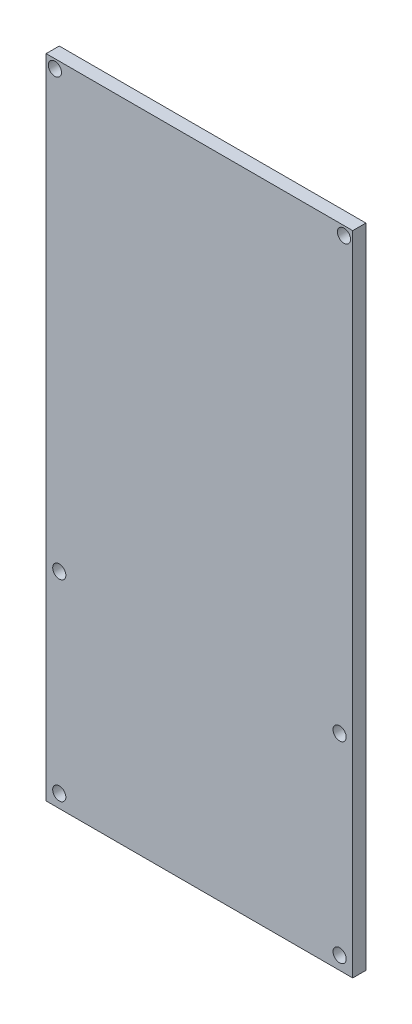
ISO-10303-21;
HEADER;
FILE_DESCRIPTION(('STEP AP214'),'2;1');
FILE_NAME('part.step','',(''),(''),'','','');
FILE_SCHEMA(('AUTOMOTIVE_DESIGN { 1 0 10303 214 1 1 1 1 }'));
ENDSEC;
DATA;
#1=APPLICATION_CONTEXT('core data for automotive mechanical design processes');
#2=APPLICATION_PROTOCOL_DEFINITION('international standard','automotive_design',2000,#1);
#3=PRODUCT_CONTEXT('',#1,'mechanical');
#4=PRODUCT('Part','Part','',(#3));
#5=PRODUCT_RELATED_PRODUCT_CATEGORY('part','',(#4));
#6=PRODUCT_DEFINITION_FORMATION('','',#4);
#7=PRODUCT_DEFINITION_CONTEXT('part definition',#1,'design');
#8=PRODUCT_DEFINITION('design','',#6,#7);
#9=PRODUCT_DEFINITION_SHAPE('','',#8);
#10=(LENGTH_UNIT() NAMED_UNIT(*) SI_UNIT(.MILLI.,.METRE.));
#11=(NAMED_UNIT(*) PLANE_ANGLE_UNIT() SI_UNIT($,.RADIAN.));
#12=(NAMED_UNIT(*) SI_UNIT($,.STERADIAN.) SOLID_ANGLE_UNIT());
#13=UNCERTAINTY_MEASURE_WITH_UNIT(LENGTH_MEASURE(1.E-05),#10,'distance_accuracy_value','');
#14=(GEOMETRIC_REPRESENTATION_CONTEXT(3) GLOBAL_UNCERTAINTY_ASSIGNED_CONTEXT((#13)) GLOBAL_UNIT_ASSIGNED_CONTEXT((#10,
#11,#12)) REPRESENTATION_CONTEXT('',''));
#15=CARTESIAN_POINT('',(0.,0.,0.));
#16=DIRECTION('',(0.,0.,1.));
#17=DIRECTION('',(1.,0.,0.));
#18=AXIS2_PLACEMENT_3D('',#15,#16,#17);
#19=CARTESIAN_POINT('',(32.,-50.8980474492835,12.7));
#20=DIRECTION('',(0.,0.,-1.));
#21=DIRECTION('',(-1.,0.,0.));
#22=AXIS2_PLACEMENT_3D('',#19,#20,#21);
#23=CYLINDRICAL_SURFACE('',#22,1.5);
#24=CARTESIAN_POINT('',(32.,-50.8980474492835,-3.));
#25=DIRECTION('',(0.,0.,-1.));
#26=DIRECTION('',(-1.,0.,0.));
#27=AXIS2_PLACEMENT_3D('',#24,#25,#26);
#28=CIRCLE('',#27,1.5);
#29=CARTESIAN_POINT('',(30.5,-50.8980474492835,-3.));
#30=VERTEX_POINT('',#29);
#31=EDGE_CURVE('E144',#30,#30,#28,.T.);
#32=ORIENTED_EDGE('',*,*,#31,.T.);
#33=EDGE_LOOP('',(#32));
#34=FACE_BOUND('',#33,.T.);
#35=CARTESIAN_POINT('',(32.,-50.8980474492835,0.));
#36=DIRECTION('',(0.,0.,1.));
#37=DIRECTION('',(1.,0.,0.));
#38=AXIS2_PLACEMENT_3D('',#35,#36,#37);
#39=CIRCLE('',#38,1.5);
#40=CARTESIAN_POINT('',(33.5,-50.8980474492835,0.));
#41=VERTEX_POINT('',#40);
#42=EDGE_CURVE('E161',#41,#41,#39,.F.);
#43=ORIENTED_EDGE('',*,*,#42,.F.);
#44=EDGE_LOOP('',(#43));
#45=FACE_BOUND('',#44,.T.);
#46=ADVANCED_FACE('F42',(#34,#45),#23,.F.);
#47=CARTESIAN_POINT('',(-32.,-94.7685274477065,12.7));
#48=DIRECTION('',(0.,0.,-1.));
#49=DIRECTION('',(-1.,0.,0.));
#50=AXIS2_PLACEMENT_3D('',#47,#48,#49);
#51=CYLINDRICAL_SURFACE('',#50,1.5);
#52=CARTESIAN_POINT('',(-32.,-94.7685274477065,-3.));
#53=DIRECTION('',(0.,0.,-1.));
#54=DIRECTION('',(-1.,0.,0.));
#55=AXIS2_PLACEMENT_3D('',#52,#53,#54);
#56=CIRCLE('',#55,1.5);
#57=CARTESIAN_POINT('',(-33.5,-94.7685274477065,-3.));
#58=VERTEX_POINT('',#57);
#59=EDGE_CURVE('E139',#58,#58,#56,.T.);
#60=ORIENTED_EDGE('',*,*,#59,.T.);
#61=EDGE_LOOP('',(#60));
#62=FACE_BOUND('',#61,.T.);
#63=CARTESIAN_POINT('',(-32.,-94.7685274477065,0.));
#64=DIRECTION('',(0.,0.,1.));
#65=DIRECTION('',(1.,0.,0.));
#66=AXIS2_PLACEMENT_3D('',#63,#64,#65);
#67=CIRCLE('',#66,1.5);
#68=CARTESIAN_POINT('',(-30.5,-94.7685274477065,0.));
#69=VERTEX_POINT('',#68);
#70=EDGE_CURVE('E153',#69,#69,#67,.F.);
#71=ORIENTED_EDGE('',*,*,#70,.F.);
#72=EDGE_LOOP('',(#71));
#73=FACE_BOUND('',#72,.T.);
#74=ADVANCED_FACE('F191',(#62,#73),#51,.F.);
#75=CARTESIAN_POINT('',(35.,-97.7685274477065,9.99999999999972));
#76=DIRECTION('',(0.,-1.,0.));
#77=DIRECTION('',(1.,0.,0.));
#78=AXIS2_PLACEMENT_3D('',#75,#76,#77);
#79=PLANE('',#78);
#80=DIRECTION('',(1.,0.,0.));
#81=VECTOR('',#80,1.);
#82=CARTESIAN_POINT('',(-35.,-97.7685274477065,0.));
#83=LINE('',#82,#81);
#84=CARTESIAN_POINT('',(-35.,-97.7685274477065,0.));
#85=VERTEX_POINT('',#84);
#86=CARTESIAN_POINT('',(35.,-97.7685274477065,0.));
#87=VERTEX_POINT('',#86);
#88=EDGE_CURVE('E85',#85,#87,#83,.T.);
#89=ORIENTED_EDGE('',*,*,#88,.F.);
#90=DIRECTION('',(0.,0.,1.));
#91=VECTOR('',#90,1.);
#92=CARTESIAN_POINT('',(-35.,-97.7685274477065,9.99999999999972));
#93=LINE('',#92,#91);
#94=CARTESIAN_POINT('',(-35.,-97.7685274477065,-3.));
#95=VERTEX_POINT('',#94);
#96=EDGE_CURVE('E106',#95,#85,#93,.T.);
#97=ORIENTED_EDGE('',*,*,#96,.F.);
#98=DIRECTION('',(-1.,0.,0.));
#99=VECTOR('',#98,1.);
#100=CARTESIAN_POINT('',(35.,-97.7685274477065,-3.));
#101=LINE('',#100,#99);
#102=CARTESIAN_POINT('',(35.,-97.7685274477065,-3.));
#103=VERTEX_POINT('',#102);
#104=EDGE_CURVE('E103',#103,#95,#101,.T.);
#105=ORIENTED_EDGE('',*,*,#104,.F.);
#106=DIRECTION('',(0.,0.,1.));
#107=VECTOR('',#106,1.);
#108=CARTESIAN_POINT('',(35.,-97.7685274477065,9.99999999999972));
#109=LINE('',#108,#107);
#110=EDGE_CURVE('E96',#103,#87,#109,.T.);
#111=ORIENTED_EDGE('',*,*,#110,.T.);
#112=EDGE_LOOP('',(#89,#97,#105,#111));
#113=FACE_BOUND('',#112,.T.);
#114=ADVANCED_FACE('F101',(#113),#79,.T.);
#115=CARTESIAN_POINT('',(35.,-50.,50.));
#116=DIRECTION('',(-1.,0.,0.));
#117=DIRECTION('',(0.,0.,1.));
#118=AXIS2_PLACEMENT_3D('',#115,#116,#117);
#119=PLANE('',#118);
#120=DIRECTION('',(0.,1.,0.));
#121=VECTOR('',#120,1.);
#122=CARTESIAN_POINT('',(35.,50.,0.));
#123=LINE('',#122,#121);
#124=CARTESIAN_POINT('',(35.,50.,0.));
#125=VERTEX_POINT('',#124);
#126=EDGE_CURVE('E87',#87,#125,#123,.T.);
#127=ORIENTED_EDGE('',*,*,#126,.F.);
#128=ORIENTED_EDGE('',*,*,#110,.F.);
#129=DIRECTION('',(0.,-1.,0.));
#130=VECTOR('',#129,1.);
#131=CARTESIAN_POINT('',(35.,50.,-3.));
#132=LINE('',#131,#130);
#133=CARTESIAN_POINT('',(35.,50.,-3.));
#134=VERTEX_POINT('',#133);
#135=EDGE_CURVE('E124',#134,#103,#132,.T.);
#136=ORIENTED_EDGE('',*,*,#135,.F.);
#137=DIRECTION('',(0.,0.,-1.));
#138=VECTOR('',#137,1.);
#139=CARTESIAN_POINT('',(35.,50.,50.));
#140=LINE('',#139,#138);
#141=EDGE_CURVE('E11',#125,#134,#140,.T.);
#142=ORIENTED_EDGE('',*,*,#141,.F.);
#143=EDGE_LOOP('',(#127,#128,#136,#142));
#144=FACE_BOUND('',#143,.T.);
#145=ADVANCED_FACE('F94',(#144),#119,.F.);
#146=CARTESIAN_POINT('',(35.,50.,50.));
#147=DIRECTION('',(0.,-1.,0.));
#148=DIRECTION('',(0.,0.,-1.));
#149=AXIS2_PLACEMENT_3D('',#146,#147,#148);
#150=PLANE('',#149);
#151=DIRECTION('',(-1.,0.,0.));
#152=VECTOR('',#151,1.);
#153=CARTESIAN_POINT('',(-35.,50.,0.));
#154=LINE('',#153,#152);
#155=CARTESIAN_POINT('',(-35.,50.,0.));
#156=VERTEX_POINT('',#155);
#157=EDGE_CURVE('E97',#125,#156,#154,.T.);
#158=ORIENTED_EDGE('',*,*,#157,.F.);
#159=ORIENTED_EDGE('',*,*,#141,.T.);
#160=DIRECTION('',(1.,0.,0.));
#161=VECTOR('',#160,1.);
#162=CARTESIAN_POINT('',(35.,50.,-3.));
#163=LINE('',#162,#161);
#164=CARTESIAN_POINT('',(-35.,50.,-3.));
#165=VERTEX_POINT('',#164);
#166=EDGE_CURVE('E112',#165,#134,#163,.T.);
#167=ORIENTED_EDGE('',*,*,#166,.F.);
#168=DIRECTION('',(0.,0.,-1.));
#169=VECTOR('',#168,1.);
#170=CARTESIAN_POINT('',(-35.,50.,50.));
#171=LINE('',#170,#169);
#172=EDGE_CURVE('E53',#156,#165,#171,.T.);
#173=ORIENTED_EDGE('',*,*,#172,.F.);
#174=EDGE_LOOP('',(#158,#159,#167,#173));
#175=FACE_BOUND('',#174,.T.);
#176=ADVANCED_FACE('F213',(#175),#150,.F.);
#177=CARTESIAN_POINT('',(-35.,-50.,50.));
#178=DIRECTION('',(1.,0.,0.));
#179=DIRECTION('',(0.,1.,0.));
#180=AXIS2_PLACEMENT_3D('',#177,#178,#179);
#181=PLANE('',#180);
#182=DIRECTION('',(0.,-1.,0.));
#183=VECTOR('',#182,1.);
#184=CARTESIAN_POINT('',(-35.,50.,0.));
#185=LINE('',#184,#183);
#186=EDGE_CURVE('E63',#156,#85,#185,.T.);
#187=ORIENTED_EDGE('',*,*,#186,.F.);
#188=ORIENTED_EDGE('',*,*,#172,.T.);
#189=DIRECTION('',(0.,1.,0.));
#190=VECTOR('',#189,1.);
#191=CARTESIAN_POINT('',(-35.,50.,-3.));
#192=LINE('',#191,#190);
#193=EDGE_CURVE('E118',#95,#165,#192,.T.);
#194=ORIENTED_EDGE('',*,*,#193,.F.);
#195=ORIENTED_EDGE('',*,*,#96,.T.);
#196=EDGE_LOOP('',(#187,#188,#194,#195));
#197=FACE_BOUND('',#196,.T.);
#198=ADVANCED_FACE('F46',(#197),#181,.F.);
#199=CARTESIAN_POINT('',(33.,48.,12.7));
#200=DIRECTION('',(0.,0.,-1.));
#201=DIRECTION('',(-1.,0.,0.));
#202=AXIS2_PLACEMENT_3D('',#199,#200,#201);
#203=CYLINDRICAL_SURFACE('',#202,1.5);
#204=CARTESIAN_POINT('',(33.,48.,-3.));
#205=DIRECTION('',(0.,0.,-1.));
#206=DIRECTION('',(-1.,0.,0.));
#207=AXIS2_PLACEMENT_3D('',#204,#205,#206);
#208=CIRCLE('',#207,1.5);
#209=CARTESIAN_POINT('',(31.5,48.,-3.));
#210=VERTEX_POINT('',#209);
#211=EDGE_CURVE('E121',#210,#210,#208,.T.);
#212=ORIENTED_EDGE('',*,*,#211,.T.);
#213=EDGE_LOOP('',(#212));
#214=FACE_BOUND('',#213,.T.);
#215=CARTESIAN_POINT('',(33.,48.,0.));
#216=DIRECTION('',(0.,0.,1.));
#217=DIRECTION('',(1.,0.,0.));
#218=AXIS2_PLACEMENT_3D('',#215,#216,#217);
#219=CIRCLE('',#218,1.5);
#220=CARTESIAN_POINT('',(34.5,48.,0.));
#221=VERTEX_POINT('',#220);
#222=EDGE_CURVE('E149',#221,#221,#219,.F.);
#223=ORIENTED_EDGE('',*,*,#222,.F.);
#224=EDGE_LOOP('',(#223));
#225=FACE_BOUND('',#224,.T.);
#226=ADVANCED_FACE('F210',(#214,#225),#203,.F.);
#227=CARTESIAN_POINT('',(-32.,-50.8980474492835,12.7));
#228=DIRECTION('',(0.,0.,-1.));
#229=DIRECTION('',(-1.,0.,0.));
#230=AXIS2_PLACEMENT_3D('',#227,#228,#229);
#231=CYLINDRICAL_SURFACE('',#230,1.5);
#232=CARTESIAN_POINT('',(-32.,-50.8980474492835,-3.));
#233=DIRECTION('',(0.,0.,-1.));
#234=DIRECTION('',(-1.,0.,0.));
#235=AXIS2_PLACEMENT_3D('',#232,#233,#234);
#236=CIRCLE('',#235,1.5);
#237=CARTESIAN_POINT('',(-33.5,-50.8980474492835,-3.));
#238=VERTEX_POINT('',#237);
#239=EDGE_CURVE('E131',#238,#238,#236,.T.);
#240=ORIENTED_EDGE('',*,*,#239,.T.);
#241=EDGE_LOOP('',(#240));
#242=FACE_BOUND('',#241,.T.);
#243=CARTESIAN_POINT('',(-32.,-50.8980474492835,0.));
#244=DIRECTION('',(0.,0.,1.));
#245=DIRECTION('',(1.,0.,0.));
#246=AXIS2_PLACEMENT_3D('',#243,#244,#245);
#247=CIRCLE('',#246,1.5);
#248=CARTESIAN_POINT('',(-30.5,-50.8980474492835,0.));
#249=VERTEX_POINT('',#248);
#250=EDGE_CURVE('E164',#249,#249,#247,.F.);
#251=ORIENTED_EDGE('',*,*,#250,.F.);
#252=EDGE_LOOP('',(#251));
#253=FACE_BOUND('',#252,.T.);
#254=ADVANCED_FACE('F204',(#242,#253),#231,.F.);
#255=CARTESIAN_POINT('',(32.,-94.7685274477065,12.7));
#256=DIRECTION('',(0.,0.,-1.));
#257=DIRECTION('',(-1.,0.,0.));
#258=AXIS2_PLACEMENT_3D('',#255,#256,#257);
#259=CYLINDRICAL_SURFACE('',#258,1.5);
#260=CARTESIAN_POINT('',(32.,-94.7685274477065,-3.));
#261=DIRECTION('',(0.,0.,-1.));
#262=DIRECTION('',(-1.,0.,0.));
#263=AXIS2_PLACEMENT_3D('',#260,#261,#262);
#264=CIRCLE('',#263,1.5);
#265=CARTESIAN_POINT('',(30.5,-94.7685274477065,-3.));
#266=VERTEX_POINT('',#265);
#267=EDGE_CURVE('E143',#266,#266,#264,.T.);
#268=ORIENTED_EDGE('',*,*,#267,.T.);
#269=EDGE_LOOP('',(#268));
#270=FACE_BOUND('',#269,.T.);
#271=CARTESIAN_POINT('',(32.,-94.7685274477065,0.));
#272=DIRECTION('',(0.,0.,1.));
#273=DIRECTION('',(1.,0.,0.));
#274=AXIS2_PLACEMENT_3D('',#271,#272,#273);
#275=CIRCLE('',#274,1.5);
#276=CARTESIAN_POINT('',(33.5,-94.7685274477065,0.));
#277=VERTEX_POINT('',#276);
#278=EDGE_CURVE('E160',#277,#277,#275,.F.);
#279=ORIENTED_EDGE('',*,*,#278,.F.);
#280=EDGE_LOOP('',(#279));
#281=FACE_BOUND('',#280,.T.);
#282=ADVANCED_FACE('F189',(#270,#281),#259,.F.);
#283=CARTESIAN_POINT('',(0.,0.,-3.));
#284=DIRECTION('',(0.,0.,-1.));
#285=DIRECTION('',(-1.,0.,0.));
#286=AXIS2_PLACEMENT_3D('',#283,#284,#285);
#287=PLANE('',#286);
#288=ORIENTED_EDGE('',*,*,#267,.F.);
#289=EDGE_LOOP('',(#288));
#290=FACE_BOUND('',#289,.T.);
#291=ORIENTED_EDGE('',*,*,#239,.F.);
#292=EDGE_LOOP('',(#291));
#293=FACE_BOUND('',#292,.T.);
#294=ORIENTED_EDGE('',*,*,#211,.F.);
#295=EDGE_LOOP('',(#294));
#296=FACE_BOUND('',#295,.T.);
#297=ORIENTED_EDGE('',*,*,#135,.T.);
#298=ORIENTED_EDGE('',*,*,#104,.T.);
#299=ORIENTED_EDGE('',*,*,#193,.T.);
#300=ORIENTED_EDGE('',*,*,#166,.T.);
#301=EDGE_LOOP('',(#297,#298,#299,#300));
#302=FACE_BOUND('',#301,.T.);
#303=CARTESIAN_POINT('',(-33.,48.,-3.));
#304=DIRECTION('',(0.,0.,-1.));
#305=DIRECTION('',(-1.,0.,0.));
#306=AXIS2_PLACEMENT_3D('',#303,#304,#305);
#307=CIRCLE('',#306,1.5);
#308=CARTESIAN_POINT('',(-34.5,48.,-3.));
#309=VERTEX_POINT('',#308);
#310=EDGE_CURVE('E129',#309,#309,#307,.T.);
#311=ORIENTED_EDGE('',*,*,#310,.F.);
#312=EDGE_LOOP('',(#311));
#313=FACE_BOUND('',#312,.T.);
#314=ORIENTED_EDGE('',*,*,#59,.F.);
#315=EDGE_LOOP('',(#314));
#316=FACE_BOUND('',#315,.T.);
#317=ORIENTED_EDGE('',*,*,#31,.F.);
#318=EDGE_LOOP('',(#317));
#319=FACE_BOUND('',#318,.T.);
#320=ADVANCED_FACE('F180',(#290,#293,#296,#302,#313,#316,#319),#287,.T.);
#321=CARTESIAN_POINT('',(-33.,48.,12.7));
#322=DIRECTION('',(0.,0.,-1.));
#323=DIRECTION('',(-1.,0.,0.));
#324=AXIS2_PLACEMENT_3D('',#321,#322,#323);
#325=CYLINDRICAL_SURFACE('',#324,1.5);
#326=ORIENTED_EDGE('',*,*,#310,.T.);
#327=EDGE_LOOP('',(#326));
#328=FACE_BOUND('',#327,.T.);
#329=CARTESIAN_POINT('',(-33.,48.,0.));
#330=DIRECTION('',(0.,0.,1.));
#331=DIRECTION('',(1.,0.,0.));
#332=AXIS2_PLACEMENT_3D('',#329,#330,#331);
#333=CIRCLE('',#332,1.5);
#334=CARTESIAN_POINT('',(-31.5,48.,0.));
#335=VERTEX_POINT('',#334);
#336=EDGE_CURVE('E48',#335,#335,#333,.F.);
#337=ORIENTED_EDGE('',*,*,#336,.F.);
#338=EDGE_LOOP('',(#337));
#339=FACE_BOUND('',#338,.T.);
#340=ADVANCED_FACE('F179',(#328,#339),#325,.F.);
#341=CARTESIAN_POINT('',(0.,0.,0.));
#342=DIRECTION('',(0.,0.,-1.));
#343=DIRECTION('',(-1.,0.,0.));
#344=AXIS2_PLACEMENT_3D('',#341,#342,#343);
#345=PLANE('',#344);
#346=ORIENTED_EDGE('',*,*,#222,.T.);
#347=EDGE_LOOP('',(#346));
#348=FACE_BOUND('',#347,.T.);
#349=ORIENTED_EDGE('',*,*,#70,.T.);
#350=EDGE_LOOP('',(#349));
#351=FACE_BOUND('',#350,.T.);
#352=ORIENTED_EDGE('',*,*,#278,.T.);
#353=EDGE_LOOP('',(#352));
#354=FACE_BOUND('',#353,.T.);
#355=ORIENTED_EDGE('',*,*,#42,.T.);
#356=EDGE_LOOP('',(#355));
#357=FACE_BOUND('',#356,.T.);
#358=ORIENTED_EDGE('',*,*,#250,.T.);
#359=EDGE_LOOP('',(#358));
#360=FACE_BOUND('',#359,.T.);
#361=ORIENTED_EDGE('',*,*,#336,.T.);
#362=EDGE_LOOP('',(#361));
#363=FACE_BOUND('',#362,.T.);
#364=ORIENTED_EDGE('',*,*,#186,.T.);
#365=ORIENTED_EDGE('',*,*,#88,.T.);
#366=ORIENTED_EDGE('',*,*,#126,.T.);
#367=ORIENTED_EDGE('',*,*,#157,.T.);
#368=EDGE_LOOP('',(#364,#365,#366,#367));
#369=FACE_BOUND('',#368,.T.);
#370=ADVANCED_FACE('F88',(#348,#351,#354,#357,#360,#363,#369),#345,.F.);
#371=CLOSED_SHELL('',(#46,#74,#114,#145,#176,#198,#226,#254,#282,#320,#340,#370));
#372=MANIFOLD_SOLID_BREP('B2',#371);
#373=ADVANCED_BREP_SHAPE_REPRESENTATION('',(#18,#372),#14);
#374=SHAPE_DEFINITION_REPRESENTATION(#9,#373);
ENDSEC;
END-ISO-10303-21;
